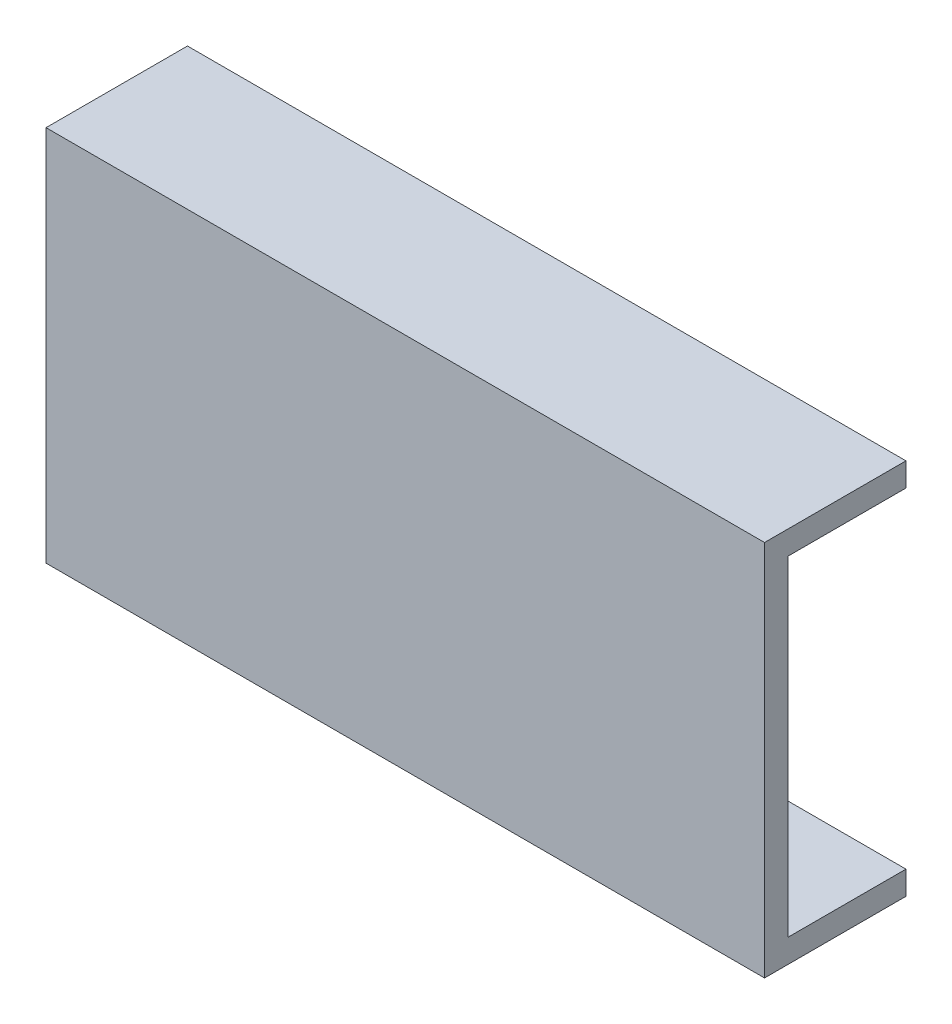
ISO-10303-21;
HEADER;
FILE_DESCRIPTION(('STEP AP214'),'2;1');
FILE_NAME('part.step','',(''),(''),'','','');
FILE_SCHEMA(('AUTOMOTIVE_DESIGN { 1 0 10303 214 1 1 1 1 }'));
ENDSEC;
DATA;
#1=APPLICATION_CONTEXT('core data for automotive mechanical design processes');
#2=APPLICATION_PROTOCOL_DEFINITION('international standard','automotive_design',2000,#1);
#3=PRODUCT_CONTEXT('',#1,'mechanical');
#4=PRODUCT('Part','Part','',(#3));
#5=PRODUCT_RELATED_PRODUCT_CATEGORY('part','',(#4));
#6=PRODUCT_DEFINITION_FORMATION('','',#4);
#7=PRODUCT_DEFINITION_CONTEXT('part definition',#1,'design');
#8=PRODUCT_DEFINITION('design','',#6,#7);
#9=PRODUCT_DEFINITION_SHAPE('','',#8);
#10=(LENGTH_UNIT() NAMED_UNIT(*) SI_UNIT(.MILLI.,.METRE.));
#11=(NAMED_UNIT(*) PLANE_ANGLE_UNIT() SI_UNIT($,.RADIAN.));
#12=(NAMED_UNIT(*) SI_UNIT($,.STERADIAN.) SOLID_ANGLE_UNIT());
#13=UNCERTAINTY_MEASURE_WITH_UNIT(LENGTH_MEASURE(1.E-05),#10,'distance_accuracy_value','');
#14=(GEOMETRIC_REPRESENTATION_CONTEXT(3) GLOBAL_UNCERTAINTY_ASSIGNED_CONTEXT((#13)) GLOBAL_UNIT_ASSIGNED_CONTEXT((#10,
#11,#12)) REPRESENTATION_CONTEXT('',''));
#15=CARTESIAN_POINT('',(0.,0.,0.));
#16=DIRECTION('',(0.,0.,1.));
#17=DIRECTION('',(1.,0.,0.));
#18=AXIS2_PLACEMENT_3D('',#15,#16,#17);
#19=CARTESIAN_POINT('',(152.4,-14.1624110638169,0.));
#20=DIRECTION('',(0.,0.,-1.));
#21=DIRECTION('',(-1.,0.,0.));
#22=AXIS2_PLACEMENT_3D('',#19,#20,#21);
#23=PLANE('',#22);
#24=DIRECTION('',(0.,-1.,0.));
#25=VECTOR('',#24,1.);
#26=CARTESIAN_POINT('',(0.,-14.1624110638169,0.));
#27=LINE('',#26,#25);
#28=CARTESIAN_POINT('',(0.,65.8375889361832,0.));
#29=VERTEX_POINT('',#28);
#30=CARTESIAN_POINT('',(0.,-14.1624110638169,0.));
#31=VERTEX_POINT('',#30);
#32=EDGE_CURVE('E129',#29,#31,#27,.T.);
#33=ORIENTED_EDGE('',*,*,#32,.T.);
#34=DIRECTION('',(-1.,0.,0.));
#35=VECTOR('',#34,1.);
#36=CARTESIAN_POINT('',(152.4,-14.1624110638169,0.));
#37=LINE('',#36,#35);
#38=CARTESIAN_POINT('',(152.4,-14.1624110638169,0.));
#39=VERTEX_POINT('',#38);
#40=EDGE_CURVE('E11',#39,#31,#37,.T.);
#41=ORIENTED_EDGE('',*,*,#40,.F.);
#42=DIRECTION('',(0.,-1.,0.));
#43=VECTOR('',#42,1.);
#44=CARTESIAN_POINT('',(152.4,-14.1624110638169,0.));
#45=LINE('',#44,#43);
#46=CARTESIAN_POINT('',(152.4,65.8375889361832,0.));
#47=VERTEX_POINT('',#46);
#48=EDGE_CURVE('E143',#47,#39,#45,.T.);
#49=ORIENTED_EDGE('',*,*,#48,.F.);
#50=DIRECTION('',(-1.,0.,0.));
#51=VECTOR('',#50,1.);
#52=CARTESIAN_POINT('',(152.4,65.8375889361832,0.));
#53=LINE('',#52,#51);
#54=EDGE_CURVE('E125',#47,#29,#53,.T.);
#55=ORIENTED_EDGE('',*,*,#54,.T.);
#56=EDGE_LOOP('',(#33,#41,#49,#55));
#57=FACE_BOUND('',#56,.T.);
#58=ADVANCED_FACE('F33',(#57),#23,.F.);
#59=CARTESIAN_POINT('',(152.4,-14.1624110638169,-30.));
#60=DIRECTION('',(0.,1.,0.));
#61=DIRECTION('',(0.,0.,1.));
#62=AXIS2_PLACEMENT_3D('',#59,#60,#61);
#63=PLANE('',#62);
#64=DIRECTION('',(0.,0.,-1.));
#65=VECTOR('',#64,1.);
#66=CARTESIAN_POINT('',(0.,-14.1624110638169,-30.));
#67=LINE('',#66,#65);
#68=CARTESIAN_POINT('',(0.,-14.1624110638169,-30.));
#69=VERTEX_POINT('',#68);
#70=EDGE_CURVE('E132',#31,#69,#67,.T.);
#71=ORIENTED_EDGE('',*,*,#70,.T.);
#72=DIRECTION('',(-1.,0.,0.));
#73=VECTOR('',#72,1.);
#74=CARTESIAN_POINT('',(152.4,-14.1624110638169,-30.));
#75=LINE('',#74,#73);
#76=CARTESIAN_POINT('',(152.4,-14.1624110638169,-30.));
#77=VERTEX_POINT('',#76);
#78=EDGE_CURVE('E41',#77,#69,#75,.T.);
#79=ORIENTED_EDGE('',*,*,#78,.F.);
#80=DIRECTION('',(0.,0.,-1.));
#81=VECTOR('',#80,1.);
#82=CARTESIAN_POINT('',(152.4,-14.1624110638169,-30.));
#83=LINE('',#82,#81);
#84=EDGE_CURVE('E92',#39,#77,#83,.T.);
#85=ORIENTED_EDGE('',*,*,#84,.F.);
#86=ORIENTED_EDGE('',*,*,#40,.T.);
#87=EDGE_LOOP('',(#71,#79,#85,#86));
#88=FACE_BOUND('',#87,.T.);
#89=ADVANCED_FACE('F178',(#88),#63,.F.);
#90=CARTESIAN_POINT('',(152.4,-9.16241106381685,-30.));
#91=DIRECTION('',(0.,0.,1.));
#92=DIRECTION('',(0.,-1.,0.));
#93=AXIS2_PLACEMENT_3D('',#90,#91,#92);
#94=PLANE('',#93);
#95=DIRECTION('',(0.,1.,0.));
#96=VECTOR('',#95,1.);
#97=CARTESIAN_POINT('',(0.,-9.16241106381685,-30.));
#98=LINE('',#97,#96);
#99=CARTESIAN_POINT('',(0.,-9.16241106381685,-30.));
#100=VERTEX_POINT('',#99);
#101=EDGE_CURVE('E134',#69,#100,#98,.T.);
#102=ORIENTED_EDGE('',*,*,#101,.T.);
#103=DIRECTION('',(-1.,0.,0.));
#104=VECTOR('',#103,1.);
#105=CARTESIAN_POINT('',(152.4,-9.16241106381685,-30.));
#106=LINE('',#105,#104);
#107=CARTESIAN_POINT('',(152.4,-9.16241106381685,-30.));
#108=VERTEX_POINT('',#107);
#109=EDGE_CURVE('E150',#108,#100,#106,.T.);
#110=ORIENTED_EDGE('',*,*,#109,.F.);
#111=DIRECTION('',(0.,1.,0.));
#112=VECTOR('',#111,1.);
#113=CARTESIAN_POINT('',(152.4,-9.16241106381685,-30.));
#114=LINE('',#113,#112);
#115=EDGE_CURVE('E158',#77,#108,#114,.T.);
#116=ORIENTED_EDGE('',*,*,#115,.F.);
#117=ORIENTED_EDGE('',*,*,#78,.T.);
#118=EDGE_LOOP('',(#102,#110,#116,#117));
#119=FACE_BOUND('',#118,.T.);
#120=ADVANCED_FACE('F156',(#119),#94,.F.);
#121=CARTESIAN_POINT('',(152.4,-9.16241106381686,-5.00000000000001));
#122=DIRECTION('',(0.,-1.,0.));
#123=DIRECTION('',(0.,0.,-1.));
#124=AXIS2_PLACEMENT_3D('',#121,#122,#123);
#125=PLANE('',#124);
#126=DIRECTION('',(0.,0.,1.));
#127=VECTOR('',#126,1.);
#128=CARTESIAN_POINT('',(0.,-9.16241106381686,-5.00000000000001));
#129=LINE('',#128,#127);
#130=CARTESIAN_POINT('',(0.,-9.16241106381686,-5.00000000000001));
#131=VERTEX_POINT('',#130);
#132=EDGE_CURVE('E136',#100,#131,#129,.T.);
#133=ORIENTED_EDGE('',*,*,#132,.T.);
#134=DIRECTION('',(-1.,0.,0.));
#135=VECTOR('',#134,1.);
#136=CARTESIAN_POINT('',(152.4,-9.16241106381686,-5.00000000000001));
#137=LINE('',#136,#135);
#138=CARTESIAN_POINT('',(152.4,-9.16241106381686,-5.00000000000001));
#139=VERTEX_POINT('',#138);
#140=EDGE_CURVE('E147',#139,#131,#137,.T.);
#141=ORIENTED_EDGE('',*,*,#140,.F.);
#142=DIRECTION('',(0.,0.,1.));
#143=VECTOR('',#142,1.);
#144=CARTESIAN_POINT('',(152.4,-9.16241106381686,-5.00000000000001));
#145=LINE('',#144,#143);
#146=EDGE_CURVE('E170',#108,#139,#145,.T.);
#147=ORIENTED_EDGE('',*,*,#146,.F.);
#148=ORIENTED_EDGE('',*,*,#109,.T.);
#149=EDGE_LOOP('',(#133,#141,#147,#148));
#150=FACE_BOUND('',#149,.T.);
#151=ADVANCED_FACE('F166',(#150),#125,.F.);
#152=CARTESIAN_POINT('',(152.4,60.8375889361832,-5.));
#153=DIRECTION('',(0.,0.,1.));
#154=DIRECTION('',(0.,-1.,0.));
#155=AXIS2_PLACEMENT_3D('',#152,#153,#154);
#156=PLANE('',#155);
#157=DIRECTION('',(0.,1.,0.));
#158=VECTOR('',#157,1.);
#159=CARTESIAN_POINT('',(0.,60.8375889361832,-5.));
#160=LINE('',#159,#158);
#161=CARTESIAN_POINT('',(0.,60.8375889361832,-5.));
#162=VERTEX_POINT('',#161);
#163=EDGE_CURVE('E138',#131,#162,#160,.T.);
#164=ORIENTED_EDGE('',*,*,#163,.T.);
#165=DIRECTION('',(-1.,0.,0.));
#166=VECTOR('',#165,1.);
#167=CARTESIAN_POINT('',(152.4,60.8375889361832,-5.));
#168=LINE('',#167,#166);
#169=CARTESIAN_POINT('',(152.4,60.8375889361832,-5.));
#170=VERTEX_POINT('',#169);
#171=EDGE_CURVE('E120',#170,#162,#168,.T.);
#172=ORIENTED_EDGE('',*,*,#171,.F.);
#173=DIRECTION('',(0.,1.,0.));
#174=VECTOR('',#173,1.);
#175=CARTESIAN_POINT('',(152.4,60.8375889361832,-5.));
#176=LINE('',#175,#174);
#177=EDGE_CURVE('E111',#139,#170,#176,.T.);
#178=ORIENTED_EDGE('',*,*,#177,.F.);
#179=ORIENTED_EDGE('',*,*,#140,.T.);
#180=EDGE_LOOP('',(#164,#172,#178,#179));
#181=FACE_BOUND('',#180,.T.);
#182=ADVANCED_FACE('F169',(#181),#156,.F.);
#183=CARTESIAN_POINT('',(152.4,60.8375889361832,-30.));
#184=DIRECTION('',(0.,1.,0.));
#185=DIRECTION('',(0.,0.,1.));
#186=AXIS2_PLACEMENT_3D('',#183,#184,#185);
#187=PLANE('',#186);
#188=DIRECTION('',(0.,0.,-1.));
#189=VECTOR('',#188,1.);
#190=CARTESIAN_POINT('',(0.,60.8375889361832,-30.));
#191=LINE('',#190,#189);
#192=CARTESIAN_POINT('',(0.,60.8375889361832,-30.));
#193=VERTEX_POINT('',#192);
#194=EDGE_CURVE('E119',#162,#193,#191,.T.);
#195=ORIENTED_EDGE('',*,*,#194,.T.);
#196=DIRECTION('',(-1.,0.,0.));
#197=VECTOR('',#196,1.);
#198=CARTESIAN_POINT('',(152.4,60.8375889361832,-30.));
#199=LINE('',#198,#197);
#200=CARTESIAN_POINT('',(152.4,60.8375889361832,-30.));
#201=VERTEX_POINT('',#200);
#202=EDGE_CURVE('E116',#201,#193,#199,.T.);
#203=ORIENTED_EDGE('',*,*,#202,.F.);
#204=DIRECTION('',(0.,0.,-1.));
#205=VECTOR('',#204,1.);
#206=CARTESIAN_POINT('',(152.4,60.8375889361832,-30.));
#207=LINE('',#206,#205);
#208=EDGE_CURVE('E105',#170,#201,#207,.T.);
#209=ORIENTED_EDGE('',*,*,#208,.F.);
#210=ORIENTED_EDGE('',*,*,#171,.T.);
#211=EDGE_LOOP('',(#195,#203,#209,#210));
#212=FACE_BOUND('',#211,.T.);
#213=ADVANCED_FACE('F117',(#212),#187,.F.);
#214=CARTESIAN_POINT('',(152.4,65.8375889361832,-30.));
#215=DIRECTION('',(0.,0.,1.));
#216=DIRECTION('',(1.,0.,0.));
#217=AXIS2_PLACEMENT_3D('',#214,#215,#216);
#218=PLANE('',#217);
#219=DIRECTION('',(0.,1.,0.));
#220=VECTOR('',#219,1.);
#221=CARTESIAN_POINT('',(0.,65.8375889361832,-30.));
#222=LINE('',#221,#220);
#223=CARTESIAN_POINT('',(0.,65.8375889361832,-30.));
#224=VERTEX_POINT('',#223);
#225=EDGE_CURVE('E78',#193,#224,#222,.T.);
#226=ORIENTED_EDGE('',*,*,#225,.T.);
#227=DIRECTION('',(-1.,0.,0.));
#228=VECTOR('',#227,1.);
#229=CARTESIAN_POINT('',(152.4,65.8375889361832,-30.));
#230=LINE('',#229,#228);
#231=CARTESIAN_POINT('',(152.4,65.8375889361832,-30.));
#232=VERTEX_POINT('',#231);
#233=EDGE_CURVE('E121',#232,#224,#230,.T.);
#234=ORIENTED_EDGE('',*,*,#233,.F.);
#235=DIRECTION('',(0.,1.,0.));
#236=VECTOR('',#235,1.);
#237=CARTESIAN_POINT('',(152.4,65.8375889361832,-30.));
#238=LINE('',#237,#236);
#239=EDGE_CURVE('E109',#201,#232,#238,.T.);
#240=ORIENTED_EDGE('',*,*,#239,.F.);
#241=ORIENTED_EDGE('',*,*,#202,.T.);
#242=EDGE_LOOP('',(#226,#234,#240,#241));
#243=FACE_BOUND('',#242,.T.);
#244=ADVANCED_FACE('F123',(#243),#218,.F.);
#245=CARTESIAN_POINT('',(152.4,65.8375889361832,0.));
#246=DIRECTION('',(0.,-1.,0.));
#247=DIRECTION('',(0.,0.,-1.));
#248=AXIS2_PLACEMENT_3D('',#245,#246,#247);
#249=PLANE('',#248);
#250=DIRECTION('',(0.,0.,1.));
#251=VECTOR('',#250,1.);
#252=CARTESIAN_POINT('',(0.,65.8375889361832,0.));
#253=LINE('',#252,#251);
#254=EDGE_CURVE('E84',#224,#29,#253,.T.);
#255=ORIENTED_EDGE('',*,*,#254,.T.);
#256=ORIENTED_EDGE('',*,*,#54,.F.);
#257=DIRECTION('',(0.,0.,1.));
#258=VECTOR('',#257,1.);
#259=CARTESIAN_POINT('',(152.4,65.8375889361832,0.));
#260=LINE('',#259,#258);
#261=EDGE_CURVE('E49',#232,#47,#260,.T.);
#262=ORIENTED_EDGE('',*,*,#261,.F.);
#263=ORIENTED_EDGE('',*,*,#233,.T.);
#264=EDGE_LOOP('',(#255,#256,#262,#263));
#265=FACE_BOUND('',#264,.T.);
#266=ADVANCED_FACE('F194',(#265),#249,.F.);
#267=CARTESIAN_POINT('',(152.4,0.,0.));
#268=DIRECTION('',(-1.,0.,0.));
#269=DIRECTION('',(0.,0.,1.));
#270=AXIS2_PLACEMENT_3D('',#267,#268,#269);
#271=PLANE('',#270);
#272=ORIENTED_EDGE('',*,*,#48,.T.);
#273=ORIENTED_EDGE('',*,*,#84,.T.);
#274=ORIENTED_EDGE('',*,*,#115,.T.);
#275=ORIENTED_EDGE('',*,*,#146,.T.);
#276=ORIENTED_EDGE('',*,*,#177,.T.);
#277=ORIENTED_EDGE('',*,*,#208,.T.);
#278=ORIENTED_EDGE('',*,*,#239,.T.);
#279=ORIENTED_EDGE('',*,*,#261,.T.);
#280=EDGE_LOOP('',(#272,#273,#274,#275,#276,#277,#278,#279));
#281=FACE_BOUND('',#280,.T.);
#282=ADVANCED_FACE('F107',(#281),#271,.F.);
#283=CARTESIAN_POINT('',(0.,0.,0.));
#284=DIRECTION('',(-1.,0.,0.));
#285=DIRECTION('',(0.,0.,1.));
#286=AXIS2_PLACEMENT_3D('',#283,#284,#285);
#287=PLANE('',#286);
#288=ORIENTED_EDGE('',*,*,#32,.F.);
#289=ORIENTED_EDGE('',*,*,#254,.F.);
#290=ORIENTED_EDGE('',*,*,#225,.F.);
#291=ORIENTED_EDGE('',*,*,#194,.F.);
#292=ORIENTED_EDGE('',*,*,#163,.F.);
#293=ORIENTED_EDGE('',*,*,#132,.F.);
#294=ORIENTED_EDGE('',*,*,#101,.F.);
#295=ORIENTED_EDGE('',*,*,#70,.F.);
#296=EDGE_LOOP('',(#288,#289,#290,#291,#292,#293,#294,#295));
#297=FACE_BOUND('',#296,.T.);
#298=ADVANCED_FACE('F162',(#297),#287,.T.);
#299=CLOSED_SHELL('',(#58,#89,#120,#151,#182,#213,#244,#266,#282,#298));
#300=MANIFOLD_SOLID_BREP('B2',#299);
#301=ADVANCED_BREP_SHAPE_REPRESENTATION('',(#18,#300),#14);
#302=SHAPE_DEFINITION_REPRESENTATION(#9,#301);
ENDSEC;
END-ISO-10303-21;
